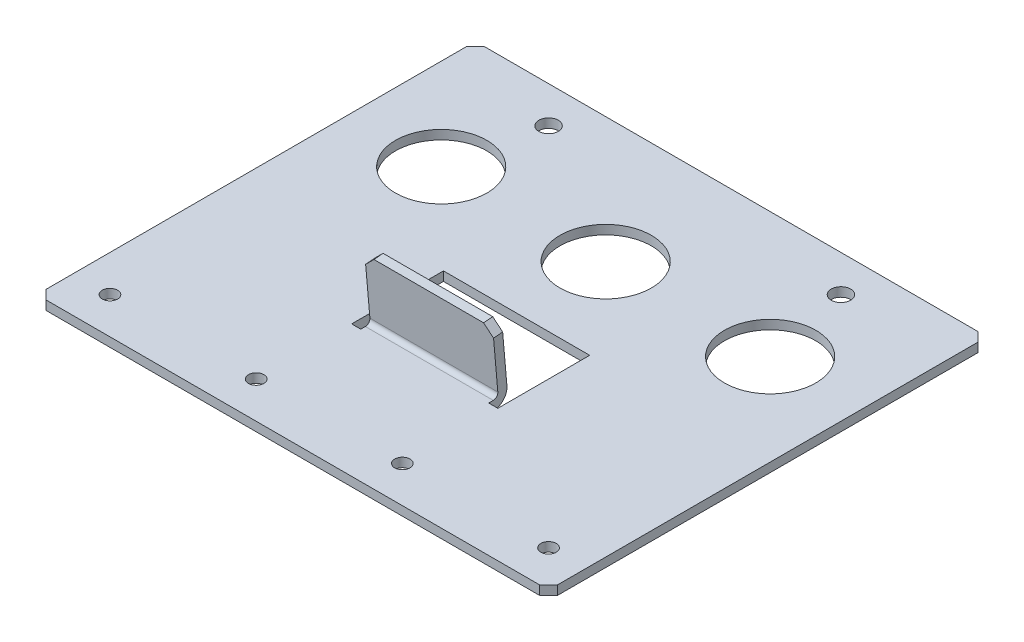
ISO-10303-21;
HEADER;
FILE_DESCRIPTION(('STEP AP214'),'2;1');
FILE_NAME('part.step','',(''),(''),'','','');
FILE_SCHEMA(('AUTOMOTIVE_DESIGN { 1 0 10303 214 1 1 1 1 }'));
ENDSEC;
DATA;
#1=APPLICATION_CONTEXT('core data for automotive mechanical design processes');
#2=APPLICATION_PROTOCOL_DEFINITION('international standard','automotive_design',2000,#1);
#3=PRODUCT_CONTEXT('',#1,'mechanical');
#4=PRODUCT('Part','Part','',(#3));
#5=PRODUCT_RELATED_PRODUCT_CATEGORY('part','',(#4));
#6=PRODUCT_DEFINITION_FORMATION('','',#4);
#7=PRODUCT_DEFINITION_CONTEXT('part definition',#1,'design');
#8=PRODUCT_DEFINITION('design','',#6,#7);
#9=PRODUCT_DEFINITION_SHAPE('','',#8);
#10=(LENGTH_UNIT() NAMED_UNIT(*) SI_UNIT(.MILLI.,.METRE.));
#11=(NAMED_UNIT(*) PLANE_ANGLE_UNIT() SI_UNIT($,.RADIAN.));
#12=(NAMED_UNIT(*) SI_UNIT($,.STERADIAN.) SOLID_ANGLE_UNIT());
#13=UNCERTAINTY_MEASURE_WITH_UNIT(LENGTH_MEASURE(1.E-05),#10,'distance_accuracy_value','');
#14=(GEOMETRIC_REPRESENTATION_CONTEXT(3) GLOBAL_UNCERTAINTY_ASSIGNED_CONTEXT((#13)) GLOBAL_UNIT_ASSIGNED_CONTEXT((#10,
#11,#12)) REPRESENTATION_CONTEXT('',''));
#15=CARTESIAN_POINT('',(0.,0.,0.));
#16=DIRECTION('',(0.,0.,1.));
#17=DIRECTION('',(1.,0.,0.));
#18=AXIS2_PLACEMENT_3D('',#15,#16,#17);
#19=CARTESIAN_POINT('',(0.,4.5484969537626,-48.8024300962654));
#20=DIRECTION('',(0.,-0.087155742747654,0.996194698091746));
#21=DIRECTION('',(0.,-0.996194698091746,-0.087155742747654));
#22=AXIS2_PLACEMENT_3D('',#19,#20,#21);
#23=PLANE('',#22);
#24=DIRECTION('',(-1.,0.,0.));
#25=VECTOR('',#24,1.);
#26=CARTESIAN_POINT('',(66.675,1.72585974161136,-49.0493788535667));
#27=LINE('',#26,#25);
#28=CARTESIAN_POINT('',(66.675,1.72585974161203,-49.04937885357));
#29=VERTEX_POINT('',#28);
#30=CARTESIAN_POINT('',(111.125,1.72585974161203,-49.04937885357));
#31=VERTEX_POINT('',#30);
#32=EDGE_CURVE('E174',#29,#31,#27,.F.);
#33=ORIENTED_EDGE('',*,*,#32,.T.);
#34=DIRECTION('',(0.,0.996194698091734,0.0871557427477868));
#35=VECTOR('',#34,1.);
#36=CARTESIAN_POINT('',(111.125,1.72585974161194,-49.0493788535734));
#37=LINE('',#36,#35);
#38=CARTESIAN_POINT('',(111.125,18.6887076818647,-47.565321957685));
#39=VERTEX_POINT('',#38);
#40=EDGE_CURVE('E326',#31,#39,#37,.T.);
#41=ORIENTED_EDGE('',*,*,#40,.T.);
#42=DIRECTION('',(-0.707106781186592,0.70441602640294,0.0616284167136347));
#43=VECTOR('',#42,1.);
#44=CARTESIAN_POINT('',(111.125,18.6887076818647,-47.565321957685));
#45=LINE('',#44,#43);
#46=CARTESIAN_POINT('',(107.95,21.8516258483066,-47.2886024744728));
#47=VERTEX_POINT('',#46);
#48=EDGE_CURVE('E217',#39,#47,#45,.T.);
#49=ORIENTED_EDGE('',*,*,#48,.T.);
#50=DIRECTION('',(1.,0.,0.));
#51=VECTOR('',#50,1.);
#52=CARTESIAN_POINT('',(111.125,21.8516258483064,-47.2886024744728));
#53=LINE('',#52,#51);
#54=CARTESIAN_POINT('',(69.8500000000001,21.8516258483066,-47.2886024744728));
#55=VERTEX_POINT('',#54);
#56=EDGE_CURVE('E223',#47,#55,#53,.F.);
#57=ORIENTED_EDGE('',*,*,#56,.T.);
#58=DIRECTION('',(-0.707106781186592,-0.70441602640294,-0.0616284167136334));
#59=VECTOR('',#58,1.);
#60=CARTESIAN_POINT('',(69.8500000000002,21.8516258483066,-47.2886024744728));
#61=LINE('',#60,#59);
#62=CARTESIAN_POINT('',(66.675,18.6887076818647,-47.565321957685));
#63=VERTEX_POINT('',#62);
#64=EDGE_CURVE('E228',#55,#63,#61,.T.);
#65=ORIENTED_EDGE('',*,*,#64,.T.);
#66=DIRECTION('',(0.,-0.996194698091734,-0.0871557427477868));
#67=VECTOR('',#66,1.);
#68=CARTESIAN_POINT('',(66.675,18.6887076818647,-47.565321957685));
#69=LINE('',#68,#67);
#70=EDGE_CURVE('E163',#63,#29,#69,.T.);
#71=ORIENTED_EDGE('',*,*,#70,.T.);
#72=EDGE_LOOP('',(#33,#41,#49,#57,#65,#71));
#73=FACE_BOUND('',#72,.T.);
#74=ADVANCED_FACE('F17',(#73),#23,.T.);
#75=CARTESIAN_POINT('',(111.125,22.1283453315292,-50.4515206409022));
#76=DIRECTION('',(0.,-0.996194698091746,-0.087155742747654));
#77=DIRECTION('',(0.,0.087155742747654,-0.996194698091746));
#78=AXIS2_PLACEMENT_3D('',#75,#76,#77);
#79=PLANE('',#78);
#80=DIRECTION('',(1.,0.,0.));
#81=VECTOR('',#80,1.);
#82=CARTESIAN_POINT('',(0.,22.1283453315285,-50.4515206408947));
#83=LINE('',#82,#81);
#84=CARTESIAN_POINT('',(107.95,22.1283453315285,-50.4515206408947));
#85=VERTEX_POINT('',#84);
#86=CARTESIAN_POINT('',(69.85,22.1283453315285,-50.4515206408947));
#87=VERTEX_POINT('',#86);
#88=EDGE_CURVE('E177',#85,#87,#83,.F.);
#89=ORIENTED_EDGE('',*,*,#88,.T.);
#90=DIRECTION('',(0.,-0.0871557427475919,0.996194698091751));
#91=VECTOR('',#90,1.);
#92=CARTESIAN_POINT('',(69.85,22.1283453315292,-50.4515206409022));
#93=LINE('',#92,#91);
#94=EDGE_CURVE('E225',#87,#55,#93,.T.);
#95=ORIENTED_EDGE('',*,*,#94,.T.);
#96=ORIENTED_EDGE('',*,*,#56,.F.);
#97=DIRECTION('',(0.,0.0871557427475908,-0.996194698091751));
#98=VECTOR('',#97,1.);
#99=CARTESIAN_POINT('',(107.95,21.8516258483067,-47.2886024744728));
#100=LINE('',#99,#98);
#101=EDGE_CURVE('E219',#47,#85,#100,.T.);
#102=ORIENTED_EDGE('',*,*,#101,.T.);
#103=EDGE_LOOP('',(#89,#95,#96,#102));
#104=FACE_BOUND('',#103,.T.);
#105=ADVANCED_FACE('F342',(#104),#79,.F.);
#106=CARTESIAN_POINT('',(69.85,22.1283453315292,-50.4515206409022));
#107=DIRECTION('',(0.707106781186503,-0.704416026402803,-0.0616284167162203));
#108=DIRECTION('',(0.705757556807996,0.708453436019904,0.));
#109=AXIS2_PLACEMENT_3D('',#106,#107,#108);
#110=PLANE('',#109);
#111=ORIENTED_EDGE('',*,*,#64,.F.);
#112=ORIENTED_EDGE('',*,*,#94,.F.);
#113=DIRECTION('',(-0.707106781186606,-0.704416026402701,-0.061628416716211));
#114=VECTOR('',#113,1.);
#115=CARTESIAN_POINT('',(69.85,22.1283453315285,-50.4515206408947));
#116=LINE('',#115,#114);
#117=CARTESIAN_POINT('',(66.675,18.9654271650877,-50.7282401241184));
#118=VERTEX_POINT('',#117);
#119=EDGE_CURVE('E314',#87,#118,#116,.T.);
#120=ORIENTED_EDGE('',*,*,#119,.T.);
#121=DIRECTION('',(0.,-0.0871557427476279,0.996194698091748));
#122=VECTOR('',#121,1.);
#123=CARTESIAN_POINT('',(66.675,18.9654271650896,-50.7282401241398));
#124=LINE('',#123,#122);
#125=EDGE_CURVE('E220',#118,#63,#124,.T.);
#126=ORIENTED_EDGE('',*,*,#125,.T.);
#127=EDGE_LOOP('',(#111,#112,#120,#126));
#128=FACE_BOUND('',#127,.T.);
#129=ADVANCED_FACE('F347',(#128),#110,.F.);
#130=CARTESIAN_POINT('',(111.125,18.9654271650896,-50.7282401241398));
#131=DIRECTION('',(-0.707106781186503,-0.704416026402803,-0.0616284167162203));
#132=DIRECTION('',(0.705757556807996,-0.708453436019904,0.));
#133=AXIS2_PLACEMENT_3D('',#130,#131,#132);
#134=PLANE('',#133);
#135=ORIENTED_EDGE('',*,*,#48,.F.);
#136=DIRECTION('',(0.,0.0871557427476279,-0.996194698091748));
#137=VECTOR('',#136,1.);
#138=CARTESIAN_POINT('',(111.125,18.6887076818647,-47.565321957685));
#139=LINE('',#138,#137);
#140=CARTESIAN_POINT('',(111.125,18.9654271650877,-50.7282401241184));
#141=VERTEX_POINT('',#140);
#142=EDGE_CURVE('E330',#39,#141,#139,.T.);
#143=ORIENTED_EDGE('',*,*,#142,.T.);
#144=DIRECTION('',(-0.707106781186607,0.7044160264027,0.0616284167162109));
#145=VECTOR('',#144,1.);
#146=CARTESIAN_POINT('',(111.125,18.9654271650877,-50.7282401241184));
#147=LINE('',#146,#145);
#148=EDGE_CURVE('E291',#141,#85,#147,.T.);
#149=ORIENTED_EDGE('',*,*,#148,.T.);
#150=ORIENTED_EDGE('',*,*,#101,.F.);
#151=EDGE_LOOP('',(#135,#143,#149,#150));
#152=FACE_BOUND('',#151,.T.);
#153=ADVANCED_FACE('F341',(#152),#134,.F.);
#154=CARTESIAN_POINT('',(66.675,1.5875,-47.467919770346));
#155=DIRECTION('',(-1.,0.,0.));
#156=DIRECTION('',(0.,0.,1.));
#157=AXIS2_PLACEMENT_3D('',#154,#155,#156);
#158=CYLINDRICAL_SURFACE('',#157,1.5875);
#159=ORIENTED_EDGE('',*,*,#32,.F.);
#160=CARTESIAN_POINT('',(66.675,1.5875,-47.467919770346));
#161=DIRECTION('',(-1.,0.,0.));
#162=DIRECTION('',(0.,0.,1.));
#163=AXIS2_PLACEMENT_3D('',#160,#161,#162);
#164=CIRCLE('',#163,1.5875);
#165=CARTESIAN_POINT('',(66.675,0.,-47.467919770346));
#166=VERTEX_POINT('',#165);
#167=EDGE_CURVE('E20',#29,#166,#164,.T.);
#168=ORIENTED_EDGE('',*,*,#167,.T.);
#169=DIRECTION('',(1.,0.,0.));
#170=VECTOR('',#169,1.);
#171=CARTESIAN_POINT('',(0.,0.,-47.467919770346));
#172=LINE('',#171,#170);
#173=CARTESIAN_POINT('',(111.125,0.,-47.467919770346));
#174=VERTEX_POINT('',#173);
#175=EDGE_CURVE('E172',#166,#174,#172,.T.);
#176=ORIENTED_EDGE('',*,*,#175,.T.);
#177=CARTESIAN_POINT('',(111.125,1.5875,-47.467919770346));
#178=DIRECTION('',(-1.,0.,0.));
#179=DIRECTION('',(0.,0.,1.));
#180=AXIS2_PLACEMENT_3D('',#177,#178,#179);
#181=CIRCLE('',#180,1.5875);
#182=EDGE_CURVE('E196',#31,#174,#181,.T.);
#183=ORIENTED_EDGE('',*,*,#182,.F.);
#184=EDGE_LOOP('',(#159,#168,#176,#183));
#185=FACE_BOUND('',#184,.T.);
#186=ADVANCED_FACE('F170',(#185),#158,.F.);
#187=CARTESIAN_POINT('',(66.675,1.5875,-47.467919770346));
#188=DIRECTION('',(1.,0.,0.));
#189=DIRECTION('',(0.,0.,-1.));
#190=AXIS2_PLACEMENT_3D('',#187,#188,#189);
#191=PLANE('',#190);
#192=DIRECTION('',(0.,-0.996194698091746,-0.087155742747654));
#193=VECTOR('',#192,1.);
#194=CARTESIAN_POINT('',(66.675,4.8252164369875,-51.9653482626948));
#195=LINE('',#194,#193);
#196=CARTESIAN_POINT('',(66.675,2.0025792248353,-52.2122970200063));
#197=VERTEX_POINT('',#196);
#198=EDGE_CURVE('E302',#118,#197,#195,.T.);
#199=ORIENTED_EDGE('',*,*,#198,.T.);
#200=CARTESIAN_POINT('',(66.675,1.5875,-47.467919770346));
#201=DIRECTION('',(-1.,0.,0.));
#202=DIRECTION('',(0.,0.,1.));
#203=AXIS2_PLACEMENT_3D('',#200,#201,#202);
#204=CIRCLE('',#203,4.7625);
#205=CARTESIAN_POINT('',(66.675,-3.175,-47.467919770346));
#206=VERTEX_POINT('',#205);
#207=EDGE_CURVE('E206',#206,#197,#204,.F.);
#208=ORIENTED_EDGE('',*,*,#207,.F.);
#209=DIRECTION('',(0.,0.,1.));
#210=VECTOR('',#209,1.);
#211=CARTESIAN_POINT('',(66.675,-3.175,-45.880419770346));
#212=LINE('',#211,#210);
#213=CARTESIAN_POINT('',(66.675,-3.175,-45.880419770346));
#214=VERTEX_POINT('',#213);
#215=EDGE_CURVE('E178',#206,#214,#212,.T.);
#216=ORIENTED_EDGE('',*,*,#215,.T.);
#217=DIRECTION('',(0.,1.,0.));
#218=VECTOR('',#217,1.);
#219=CARTESIAN_POINT('',(66.675,0.,-45.880419770346));
#220=LINE('',#219,#218);
#221=CARTESIAN_POINT('',(66.675,0.,-45.880419770346));
#222=VERTEX_POINT('',#221);
#223=EDGE_CURVE('E191',#222,#214,#220,.F.);
#224=ORIENTED_EDGE('',*,*,#223,.F.);
#225=DIRECTION('',(0.,0.,-1.));
#226=VECTOR('',#225,1.);
#227=CARTESIAN_POINT('',(66.675,0.,0.));
#228=LINE('',#227,#226);
#229=EDGE_CURVE('E183',#222,#166,#228,.T.);
#230=ORIENTED_EDGE('',*,*,#229,.T.);
#231=ORIENTED_EDGE('',*,*,#167,.F.);
#232=ORIENTED_EDGE('',*,*,#70,.F.);
#233=ORIENTED_EDGE('',*,*,#125,.F.);
#234=EDGE_LOOP('',(#199,#208,#216,#224,#230,#231,#232,#233));
#235=FACE_BOUND('',#234,.T.);
#236=ADVANCED_FACE('F189',(#235),#191,.F.);
#237=CARTESIAN_POINT('',(0.,4.8252164369875,-51.9653482626948));
#238=DIRECTION('',(0.,-0.087155742747654,0.996194698091746));
#239=DIRECTION('',(0.,-0.996194698091746,-0.087155742747654));
#240=AXIS2_PLACEMENT_3D('',#237,#238,#239);
#241=PLANE('',#240);
#242=DIRECTION('',(0.,-0.996194698091746,-0.087155742747654));
#243=VECTOR('',#242,1.);
#244=CARTESIAN_POINT('',(111.125,4.8252164369875,-51.9653482626948));
#245=LINE('',#244,#243);
#246=CARTESIAN_POINT('',(111.125,2.00257922483559,-52.2122970200062));
#247=VERTEX_POINT('',#246);
#248=EDGE_CURVE('E295',#247,#141,#245,.F.);
#249=ORIENTED_EDGE('',*,*,#248,.F.);
#250=DIRECTION('',(-1.,0.,0.));
#251=VECTOR('',#250,1.);
#252=CARTESIAN_POINT('',(66.675,2.0025792248352,-52.212297020008));
#253=LINE('',#252,#251);
#254=EDGE_CURVE('E280',#197,#247,#253,.F.);
#255=ORIENTED_EDGE('',*,*,#254,.F.);
#256=ORIENTED_EDGE('',*,*,#198,.F.);
#257=ORIENTED_EDGE('',*,*,#119,.F.);
#258=ORIENTED_EDGE('',*,*,#88,.F.);
#259=ORIENTED_EDGE('',*,*,#148,.F.);
#260=EDGE_LOOP('',(#249,#255,#256,#257,#258,#259));
#261=FACE_BOUND('',#260,.T.);
#262=ADVANCED_FACE('F353',(#261),#241,.F.);
#263=CARTESIAN_POINT('',(111.125,0.,-47.467919770346));
#264=DIRECTION('',(1.,0.,0.));
#265=DIRECTION('',(0.,0.,-1.));
#266=AXIS2_PLACEMENT_3D('',#263,#264,#265);
#267=PLANE('',#266);
#268=DIRECTION('',(0.,1.,0.));
#269=VECTOR('',#268,1.);
#270=CARTESIAN_POINT('',(111.125,0.,-45.880419770346));
#271=LINE('',#270,#269);
#272=CARTESIAN_POINT('',(111.125,-3.175,-45.880419770346));
#273=VERTEX_POINT('',#272);
#274=CARTESIAN_POINT('',(111.125,0.,-45.880419770346));
#275=VERTEX_POINT('',#274);
#276=EDGE_CURVE('E279',#273,#275,#271,.T.);
#277=ORIENTED_EDGE('',*,*,#276,.F.);
#278=DIRECTION('',(0.,0.,-1.));
#279=VECTOR('',#278,1.);
#280=CARTESIAN_POINT('',(111.125,-3.175,-47.467919770346));
#281=LINE('',#280,#279);
#282=CARTESIAN_POINT('',(111.125,-3.175,-47.467919770346));
#283=VERTEX_POINT('',#282);
#284=EDGE_CURVE('E193',#273,#283,#281,.T.);
#285=ORIENTED_EDGE('',*,*,#284,.T.);
#286=CARTESIAN_POINT('',(111.125,1.5875,-47.467919770346));
#287=DIRECTION('',(-1.,0.,0.));
#288=DIRECTION('',(0.,0.,1.));
#289=AXIS2_PLACEMENT_3D('',#286,#287,#288);
#290=CIRCLE('',#289,4.7625);
#291=EDGE_CURVE('E276',#247,#283,#290,.T.);
#292=ORIENTED_EDGE('',*,*,#291,.F.);
#293=ORIENTED_EDGE('',*,*,#248,.T.);
#294=ORIENTED_EDGE('',*,*,#142,.F.);
#295=ORIENTED_EDGE('',*,*,#40,.F.);
#296=ORIENTED_EDGE('',*,*,#182,.T.);
#297=DIRECTION('',(0.,0.,-1.));
#298=VECTOR('',#297,1.);
#299=CARTESIAN_POINT('',(111.125,0.,0.));
#300=LINE('',#299,#298);
#301=EDGE_CURVE('E186',#174,#275,#300,.F.);
#302=ORIENTED_EDGE('',*,*,#301,.T.);
#303=EDGE_LOOP('',(#277,#285,#292,#293,#294,#295,#296,#302));
#304=FACE_BOUND('',#303,.T.);
#305=ADVANCED_FACE('F339',(#304),#267,.T.);
#306=CARTESIAN_POINT('',(0.,0.,0.));
#307=DIRECTION('',(0.,-1.,0.));
#308=DIRECTION('',(0.,0.,-1.));
#309=AXIS2_PLACEMENT_3D('',#306,#307,#308);
#310=PLANE('',#309);
#311=DIRECTION('',(1.,0.,0.));
#312=VECTOR('',#311,1.);
#313=CARTESIAN_POINT('',(0.,0.,-77.7875));
#314=LINE('',#313,#312);
#315=CARTESIAN_POINT('',(114.3,0.,-77.7875));
#316=VERTEX_POINT('',#315);
#317=CARTESIAN_POINT('',(63.5,0.,-77.7875));
#318=VERTEX_POINT('',#317);
#319=EDGE_CURVE('E424',#316,#318,#314,.F.);
#320=ORIENTED_EDGE('',*,*,#319,.F.);
#321=DIRECTION('',(0.,0.,1.));
#322=VECTOR('',#321,1.);
#323=CARTESIAN_POINT('',(114.3,0.,0.));
#324=LINE('',#323,#322);
#325=CARTESIAN_POINT('',(114.3,0.,-45.880419770346));
#326=VERTEX_POINT('',#325);
#327=EDGE_CURVE('E429',#326,#316,#324,.F.);
#328=ORIENTED_EDGE('',*,*,#327,.F.);
#329=DIRECTION('',(-1.,0.,0.));
#330=VECTOR('',#329,1.);
#331=CARTESIAN_POINT('',(111.125,0.,-45.880419770346));
#332=LINE('',#331,#330);
#333=EDGE_CURVE('E365',#275,#326,#332,.F.);
#334=ORIENTED_EDGE('',*,*,#333,.F.);
#335=ORIENTED_EDGE('',*,*,#301,.F.);
#336=ORIENTED_EDGE('',*,*,#175,.F.);
#337=ORIENTED_EDGE('',*,*,#229,.F.);
#338=DIRECTION('',(-1.,0.,0.));
#339=VECTOR('',#338,1.);
#340=CARTESIAN_POINT('',(65.0875,0.,-45.880419770346));
#341=LINE('',#340,#339);
#342=CARTESIAN_POINT('',(63.5,0.,-45.880419770346));
#343=VERTEX_POINT('',#342);
#344=EDGE_CURVE('E207',#343,#222,#341,.F.);
#345=ORIENTED_EDGE('',*,*,#344,.F.);
#346=DIRECTION('',(0.,0.,1.));
#347=VECTOR('',#346,1.);
#348=CARTESIAN_POINT('',(63.5,0.,0.));
#349=LINE('',#348,#347);
#350=EDGE_CURVE('E422',#343,#318,#349,.F.);
#351=ORIENTED_EDGE('',*,*,#350,.T.);
#352=EDGE_LOOP('',(#320,#328,#334,#335,#336,#337,#345,#351));
#353=FACE_BOUND('',#352,.T.);
#354=CARTESIAN_POINT('',(38.1,0.,-139.7));
#355=DIRECTION('',(0.,1.,0.));
#356=DIRECTION('',(0.,0.,1.));
#357=AXIS2_PLACEMENT_3D('',#354,#355,#356);
#358=CIRCLE('',#357,3.3782);
#359=CARTESIAN_POINT('',(38.1,0.,-136.3218));
#360=VERTEX_POINT('',#359);
#361=EDGE_CURVE('E256',#360,#360,#358,.F.);
#362=ORIENTED_EDGE('',*,*,#361,.T.);
#363=EDGE_LOOP('',(#362));
#364=FACE_BOUND('',#363,.T.);
#365=CARTESIAN_POINT('',(139.7,0.,-139.7));
#366=DIRECTION('',(0.,1.,0.));
#367=DIRECTION('',(0.,0.,1.));
#368=AXIS2_PLACEMENT_3D('',#365,#366,#367);
#369=CIRCLE('',#368,3.3782);
#370=CARTESIAN_POINT('',(139.7,0.,-136.3218));
#371=VERTEX_POINT('',#370);
#372=EDGE_CURVE('E260',#371,#371,#369,.F.);
#373=ORIENTED_EDGE('',*,*,#372,.T.);
#374=EDGE_LOOP('',(#373));
#375=FACE_BOUND('',#374,.T.);
#376=CARTESIAN_POINT('',(12.7,0.,-12.7));
#377=DIRECTION('',(0.,1.,0.));
#378=DIRECTION('',(0.,0.,1.));
#379=AXIS2_PLACEMENT_3D('',#376,#377,#378);
#380=CIRCLE('',#379,2.667);
#381=CARTESIAN_POINT('',(12.7,0.,-10.033));
#382=VERTEX_POINT('',#381);
#383=EDGE_CURVE('E263',#382,#382,#380,.F.);
#384=ORIENTED_EDGE('',*,*,#383,.T.);
#385=EDGE_LOOP('',(#384));
#386=FACE_BOUND('',#385,.T.);
#387=CARTESIAN_POINT('',(165.1,0.,-12.7));
#388=DIRECTION('',(0.,1.,0.));
#389=DIRECTION('',(0.,0.,1.));
#390=AXIS2_PLACEMENT_3D('',#387,#388,#389);
#391=CIRCLE('',#390,2.667);
#392=CARTESIAN_POINT('',(165.1,0.,-10.033));
#393=VERTEX_POINT('',#392);
#394=EDGE_CURVE('E266',#393,#393,#391,.F.);
#395=ORIENTED_EDGE('',*,*,#394,.T.);
#396=EDGE_LOOP('',(#395));
#397=FACE_BOUND('',#396,.T.);
#398=CARTESIAN_POINT('',(63.5,0.,-12.7));
#399=DIRECTION('',(0.,1.,0.));
#400=DIRECTION('',(0.,0.,1.));
#401=AXIS2_PLACEMENT_3D('',#398,#399,#400);
#402=CIRCLE('',#401,2.667);
#403=CARTESIAN_POINT('',(63.5,0.,-10.033));
#404=VERTEX_POINT('',#403);
#405=EDGE_CURVE('E269',#404,#404,#402,.F.);
#406=ORIENTED_EDGE('',*,*,#405,.T.);
#407=EDGE_LOOP('',(#406));
#408=FACE_BOUND('',#407,.T.);
#409=CARTESIAN_POINT('',(114.3,0.,-12.7));
#410=DIRECTION('',(0.,1.,0.));
#411=DIRECTION('',(0.,0.,1.));
#412=AXIS2_PLACEMENT_3D('',#409,#410,#411);
#413=CIRCLE('',#412,2.667);
#414=CARTESIAN_POINT('',(114.3,0.,-10.033));
#415=VERTEX_POINT('',#414);
#416=EDGE_CURVE('E272',#415,#415,#413,.F.);
#417=ORIENTED_EDGE('',*,*,#416,.T.);
#418=EDGE_LOOP('',(#417));
#419=FACE_BOUND('',#418,.T.);
#420=CARTESIAN_POINT('',(88.9,0.,-108.74375));
#421=DIRECTION('',(0.,1.,0.));
#422=DIRECTION('',(0.,0.,1.));
#423=AXIS2_PLACEMENT_3D('',#420,#421,#422);
#424=CIRCLE('',#423,15.875);
#425=CARTESIAN_POINT('',(88.9,0.,-92.86875));
#426=VERTEX_POINT('',#425);
#427=EDGE_CURVE('E282',#426,#426,#424,.F.);
#428=ORIENTED_EDGE('',*,*,#427,.T.);
#429=EDGE_LOOP('',(#428));
#430=FACE_BOUND('',#429,.T.);
#431=CARTESIAN_POINT('',(146.05,0.,-108.74375));
#432=DIRECTION('',(0.,1.,0.));
#433=DIRECTION('',(0.,0.,1.));
#434=AXIS2_PLACEMENT_3D('',#431,#432,#433);
#435=CIRCLE('',#434,15.875);
#436=CARTESIAN_POINT('',(146.05,0.,-92.86875));
#437=VERTEX_POINT('',#436);
#438=EDGE_CURVE('E285',#437,#437,#435,.F.);
#439=ORIENTED_EDGE('',*,*,#438,.T.);
#440=EDGE_LOOP('',(#439));
#441=FACE_BOUND('',#440,.T.);
#442=CARTESIAN_POINT('',(31.75,0.,-108.74375));
#443=DIRECTION('',(0.,1.,0.));
#444=DIRECTION('',(0.,0.,1.));
#445=AXIS2_PLACEMENT_3D('',#442,#443,#444);
#446=CIRCLE('',#445,15.875);
#447=CARTESIAN_POINT('',(31.75,0.,-92.86875));
#448=VERTEX_POINT('',#447);
#449=EDGE_CURVE('E288',#448,#448,#446,.F.);
#450=ORIENTED_EDGE('',*,*,#449,.T.);
#451=EDGE_LOOP('',(#450));
#452=FACE_BOUND('',#451,.T.);
#453=DIRECTION('',(0.,0.,1.));
#454=VECTOR('',#453,1.);
#455=CARTESIAN_POINT('',(0.,0.,0.));
#456=LINE('',#455,#454);
#457=CARTESIAN_POINT('',(0.,0.,-3.175));
#458=VERTEX_POINT('',#457);
#459=CARTESIAN_POINT('',(0.,0.,-149.225));
#460=VERTEX_POINT('',#459);
#461=EDGE_CURVE('E290',#458,#460,#456,.F.);
#462=ORIENTED_EDGE('',*,*,#461,.F.);
#463=DIRECTION('',(-0.707106781186548,0.,-0.707106781186548));
#464=VECTOR('',#463,1.);
#465=CARTESIAN_POINT('',(0.,0.,-3.175));
#466=LINE('',#465,#464);
#467=CARTESIAN_POINT('',(3.175,0.,0.));
#468=VERTEX_POINT('',#467);
#469=EDGE_CURVE('E446',#458,#468,#466,.F.);
#470=ORIENTED_EDGE('',*,*,#469,.T.);
#471=DIRECTION('',(1.,0.,0.));
#472=VECTOR('',#471,1.);
#473=CARTESIAN_POINT('',(0.,0.,0.));
#474=LINE('',#473,#472);
#475=CARTESIAN_POINT('',(174.625,0.,0.));
#476=VERTEX_POINT('',#475);
#477=EDGE_CURVE('E448',#476,#468,#474,.F.);
#478=ORIENTED_EDGE('',*,*,#477,.F.);
#479=DIRECTION('',(-0.707106781186548,0.,0.707106781186548));
#480=VECTOR('',#479,1.);
#481=CARTESIAN_POINT('',(174.625,0.,0.));
#482=LINE('',#481,#480);
#483=CARTESIAN_POINT('',(177.8,0.,-3.175));
#484=VERTEX_POINT('',#483);
#485=EDGE_CURVE('E456',#476,#484,#482,.F.);
#486=ORIENTED_EDGE('',*,*,#485,.T.);
#487=DIRECTION('',(0.,0.,-1.));
#488=VECTOR('',#487,1.);
#489=CARTESIAN_POINT('',(177.8,0.,0.));
#490=LINE('',#489,#488);
#491=CARTESIAN_POINT('',(177.8,0.,-149.225));
#492=VERTEX_POINT('',#491);
#493=EDGE_CURVE('E458',#492,#484,#490,.F.);
#494=ORIENTED_EDGE('',*,*,#493,.F.);
#495=DIRECTION('',(0.707106781186548,0.,0.707106781186548));
#496=VECTOR('',#495,1.);
#497=CARTESIAN_POINT('',(177.8,0.,-149.225));
#498=LINE('',#497,#496);
#499=CARTESIAN_POINT('',(174.625,0.,-152.4));
#500=VERTEX_POINT('',#499);
#501=EDGE_CURVE('E466',#492,#500,#498,.F.);
#502=ORIENTED_EDGE('',*,*,#501,.T.);
#503=DIRECTION('',(-1.,0.,0.));
#504=VECTOR('',#503,1.);
#505=CARTESIAN_POINT('',(0.,0.,-152.4));
#506=LINE('',#505,#504);
#507=CARTESIAN_POINT('',(3.175,0.,-152.4));
#508=VERTEX_POINT('',#507);
#509=EDGE_CURVE('E468',#508,#500,#506,.F.);
#510=ORIENTED_EDGE('',*,*,#509,.F.);
#511=DIRECTION('',(0.707106781186548,0.,-0.707106781186548));
#512=VECTOR('',#511,1.);
#513=CARTESIAN_POINT('',(3.175,0.,-152.4));
#514=LINE('',#513,#512);
#515=EDGE_CURVE('E382',#508,#460,#514,.F.);
#516=ORIENTED_EDGE('',*,*,#515,.T.);
#517=EDGE_LOOP('',(#462,#470,#478,#486,#494,#502,#510,#516));
#518=FACE_BOUND('',#517,.T.);
#519=ADVANCED_FACE('F181',(#353,#364,#375,#386,#397,#408,#419,#430,#441,#452,#518),#310,.F.);
#520=CARTESIAN_POINT('',(3.175,-3.175,-152.4));
#521=DIRECTION('',(0.707106781186548,0.,0.707106781186548));
#522=DIRECTION('',(0.707106781186548,0.,-0.707106781186548));
#523=AXIS2_PLACEMENT_3D('',#520,#521,#522);
#524=PLANE('',#523);
#525=ORIENTED_EDGE('',*,*,#515,.F.);
#526=DIRECTION('',(0.,1.,0.));
#527=VECTOR('',#526,1.);
#528=CARTESIAN_POINT('',(3.175,-3.175,-152.4));
#529=LINE('',#528,#527);
#530=CARTESIAN_POINT('',(3.175,-3.175,-152.4));
#531=VERTEX_POINT('',#530);
#532=EDGE_CURVE('E470',#531,#508,#529,.T.);
#533=ORIENTED_EDGE('',*,*,#532,.F.);
#534=DIRECTION('',(0.707106781186549,0.,-0.707106781186546));
#535=VECTOR('',#534,1.);
#536=CARTESIAN_POINT('',(0.,-3.175,-149.225));
#537=LINE('',#536,#535);
#538=CARTESIAN_POINT('',(0.,-3.175,-149.225));
#539=VERTEX_POINT('',#538);
#540=EDGE_CURVE('E259',#539,#531,#537,.T.);
#541=ORIENTED_EDGE('',*,*,#540,.F.);
#542=DIRECTION('',(0.,1.,0.));
#543=VECTOR('',#542,1.);
#544=CARTESIAN_POINT('',(0.,-3.175,-149.225));
#545=LINE('',#544,#543);
#546=EDGE_CURVE('E441',#460,#539,#545,.F.);
#547=ORIENTED_EDGE('',*,*,#546,.F.);
#548=EDGE_LOOP('',(#525,#533,#541,#547));
#549=FACE_BOUND('',#548,.T.);
#550=ADVANCED_FACE('F533',(#549),#524,.F.);
#551=CARTESIAN_POINT('',(0.,-3.175,-152.4));
#552=DIRECTION('',(0.,0.,-1.));
#553=DIRECTION('',(-1.,0.,0.));
#554=AXIS2_PLACEMENT_3D('',#551,#552,#553);
#555=PLANE('',#554);
#556=DIRECTION('',(0.,1.,0.));
#557=VECTOR('',#556,1.);
#558=CARTESIAN_POINT('',(174.625,-3.175,-152.4));
#559=LINE('',#558,#557);
#560=CARTESIAN_POINT('',(174.625,-3.175,-152.4));
#561=VERTEX_POINT('',#560);
#562=EDGE_CURVE('E464',#500,#561,#559,.F.);
#563=ORIENTED_EDGE('',*,*,#562,.T.);
#564=DIRECTION('',(1.,0.,0.));
#565=VECTOR('',#564,1.);
#566=CARTESIAN_POINT('',(0.,-3.175,-152.4));
#567=LINE('',#566,#565);
#568=EDGE_CURVE('E415',#531,#561,#567,.T.);
#569=ORIENTED_EDGE('',*,*,#568,.F.);
#570=ORIENTED_EDGE('',*,*,#532,.T.);
#571=ORIENTED_EDGE('',*,*,#509,.T.);
#572=EDGE_LOOP('',(#563,#569,#570,#571));
#573=FACE_BOUND('',#572,.T.);
#574=ADVANCED_FACE('F564',(#573),#555,.T.);
#575=CARTESIAN_POINT('',(177.8,-3.175,-149.225));
#576=DIRECTION('',(-0.707106781186548,0.,0.707106781186548));
#577=DIRECTION('',(0.707106781186548,0.,0.707106781186548));
#578=AXIS2_PLACEMENT_3D('',#575,#576,#577);
#579=PLANE('',#578);
#580=ORIENTED_EDGE('',*,*,#501,.F.);
#581=DIRECTION('',(0.,1.,0.));
#582=VECTOR('',#581,1.);
#583=CARTESIAN_POINT('',(177.8,-3.175,-149.225));
#584=LINE('',#583,#582);
#585=CARTESIAN_POINT('',(177.8,-3.175,-149.225));
#586=VERTEX_POINT('',#585);
#587=EDGE_CURVE('E461',#586,#492,#584,.T.);
#588=ORIENTED_EDGE('',*,*,#587,.F.);
#589=DIRECTION('',(0.707106781186548,0.,0.707106781186548));
#590=VECTOR('',#589,1.);
#591=CARTESIAN_POINT('',(174.625,-3.175,-152.4));
#592=LINE('',#591,#590);
#593=EDGE_CURVE('E412',#561,#586,#592,.T.);
#594=ORIENTED_EDGE('',*,*,#593,.F.);
#595=ORIENTED_EDGE('',*,*,#562,.F.);
#596=EDGE_LOOP('',(#580,#588,#594,#595));
#597=FACE_BOUND('',#596,.T.);
#598=ADVANCED_FACE('F563',(#597),#579,.F.);
#599=CARTESIAN_POINT('',(177.8,-3.175,0.));
#600=DIRECTION('',(1.,0.,0.));
#601=DIRECTION('',(0.,0.,-1.));
#602=AXIS2_PLACEMENT_3D('',#599,#600,#601);
#603=PLANE('',#602);
#604=DIRECTION('',(0.,1.,0.));
#605=VECTOR('',#604,1.);
#606=CARTESIAN_POINT('',(177.8,-3.175,-3.17499999999999));
#607=LINE('',#606,#605);
#608=CARTESIAN_POINT('',(177.8,-3.175,-3.175));
#609=VERTEX_POINT('',#608);
#610=EDGE_CURVE('E454',#484,#609,#607,.F.);
#611=ORIENTED_EDGE('',*,*,#610,.T.);
#612=DIRECTION('',(0.,0.,-1.));
#613=VECTOR('',#612,1.);
#614=CARTESIAN_POINT('',(177.8,-3.175,0.));
#615=LINE('',#614,#613);
#616=EDGE_CURVE('E409',#586,#609,#615,.F.);
#617=ORIENTED_EDGE('',*,*,#616,.F.);
#618=ORIENTED_EDGE('',*,*,#587,.T.);
#619=ORIENTED_EDGE('',*,*,#493,.T.);
#620=EDGE_LOOP('',(#611,#617,#618,#619));
#621=FACE_BOUND('',#620,.T.);
#622=ADVANCED_FACE('F555',(#621),#603,.T.);
#623=CARTESIAN_POINT('',(174.625,-3.175,0.));
#624=DIRECTION('',(-0.707106781186548,0.,-0.707106781186548));
#625=DIRECTION('',(-0.707106781186548,0.,0.707106781186548));
#626=AXIS2_PLACEMENT_3D('',#623,#624,#625);
#627=PLANE('',#626);
#628=ORIENTED_EDGE('',*,*,#485,.F.);
#629=DIRECTION('',(0.,1.,0.));
#630=VECTOR('',#629,1.);
#631=CARTESIAN_POINT('',(174.625,-3.175,0.));
#632=LINE('',#631,#630);
#633=CARTESIAN_POINT('',(174.625,-3.175,0.));
#634=VERTEX_POINT('',#633);
#635=EDGE_CURVE('E451',#634,#476,#632,.T.);
#636=ORIENTED_EDGE('',*,*,#635,.F.);
#637=DIRECTION('',(-0.707106781186546,0.,0.707106781186549));
#638=VECTOR('',#637,1.);
#639=CARTESIAN_POINT('',(177.8,-3.175,-3.175));
#640=LINE('',#639,#638);
#641=EDGE_CURVE('E406',#609,#634,#640,.T.);
#642=ORIENTED_EDGE('',*,*,#641,.F.);
#643=ORIENTED_EDGE('',*,*,#610,.F.);
#644=EDGE_LOOP('',(#628,#636,#642,#643));
#645=FACE_BOUND('',#644,.T.);
#646=ADVANCED_FACE('F558',(#645),#627,.F.);
#647=CARTESIAN_POINT('',(0.,-3.175,0.));
#648=DIRECTION('',(0.,0.,1.));
#649=DIRECTION('',(1.,0.,0.));
#650=AXIS2_PLACEMENT_3D('',#647,#648,#649);
#651=PLANE('',#650);
#652=DIRECTION('',(0.,1.,0.));
#653=VECTOR('',#652,1.);
#654=CARTESIAN_POINT('',(3.175,-3.175,0.));
#655=LINE('',#654,#653);
#656=CARTESIAN_POINT('',(3.175,-3.175,0.));
#657=VERTEX_POINT('',#656);
#658=EDGE_CURVE('E444',#468,#657,#655,.F.);
#659=ORIENTED_EDGE('',*,*,#658,.T.);
#660=DIRECTION('',(1.,0.,0.));
#661=VECTOR('',#660,1.);
#662=CARTESIAN_POINT('',(0.,-3.175,0.));
#663=LINE('',#662,#661);
#664=EDGE_CURVE('E403',#634,#657,#663,.F.);
#665=ORIENTED_EDGE('',*,*,#664,.F.);
#666=ORIENTED_EDGE('',*,*,#635,.T.);
#667=ORIENTED_EDGE('',*,*,#477,.T.);
#668=EDGE_LOOP('',(#659,#665,#666,#667));
#669=FACE_BOUND('',#668,.T.);
#670=ADVANCED_FACE('F550',(#669),#651,.T.);
#671=CARTESIAN_POINT('',(0.,-3.175,-3.175));
#672=DIRECTION('',(0.707106781186548,0.,-0.707106781186548));
#673=DIRECTION('',(-0.707106781186548,0.,-0.707106781186548));
#674=AXIS2_PLACEMENT_3D('',#671,#672,#673);
#675=PLANE('',#674);
#676=ORIENTED_EDGE('',*,*,#469,.F.);
#677=DIRECTION('',(0.,1.,0.));
#678=VECTOR('',#677,1.);
#679=CARTESIAN_POINT('',(0.,-3.175,-3.175));
#680=LINE('',#679,#678);
#681=CARTESIAN_POINT('',(0.,-3.175,-3.175));
#682=VERTEX_POINT('',#681);
#683=EDGE_CURVE('E438',#682,#458,#680,.T.);
#684=ORIENTED_EDGE('',*,*,#683,.F.);
#685=DIRECTION('',(-0.707106781186547,0.,-0.707106781186547));
#686=VECTOR('',#685,1.);
#687=CARTESIAN_POINT('',(3.175,-3.175,0.));
#688=LINE('',#687,#686);
#689=EDGE_CURVE('E400',#657,#682,#688,.T.);
#690=ORIENTED_EDGE('',*,*,#689,.F.);
#691=ORIENTED_EDGE('',*,*,#658,.F.);
#692=EDGE_LOOP('',(#676,#684,#690,#691));
#693=FACE_BOUND('',#692,.T.);
#694=ADVANCED_FACE('F546',(#693),#675,.F.);
#695=CARTESIAN_POINT('',(0.,-3.175,0.));
#696=DIRECTION('',(-1.,0.,0.));
#697=DIRECTION('',(0.,0.,1.));
#698=AXIS2_PLACEMENT_3D('',#695,#696,#697);
#699=PLANE('',#698);
#700=ORIENTED_EDGE('',*,*,#683,.T.);
#701=ORIENTED_EDGE('',*,*,#461,.T.);
#702=ORIENTED_EDGE('',*,*,#546,.T.);
#703=DIRECTION('',(0.,0.,-1.));
#704=VECTOR('',#703,1.);
#705=CARTESIAN_POINT('',(0.,-3.175,0.));
#706=LINE('',#705,#704);
#707=EDGE_CURVE('E255',#682,#539,#706,.T.);
#708=ORIENTED_EDGE('',*,*,#707,.F.);
#709=EDGE_LOOP('',(#700,#701,#702,#708));
#710=FACE_BOUND('',#709,.T.);
#711=ADVANCED_FACE('F543',(#710),#699,.T.);
#712=CARTESIAN_POINT('',(31.75,-3.175,-108.74375));
#713=DIRECTION('',(0.,1.,0.));
#714=DIRECTION('',(0.,0.,1.));
#715=AXIS2_PLACEMENT_3D('',#712,#713,#714);
#716=CYLINDRICAL_SURFACE('',#715,15.875);
#717=CARTESIAN_POINT('',(31.75,-3.175,-108.74375));
#718=DIRECTION('',(0.,1.,0.));
#719=DIRECTION('',(0.,0.,1.));
#720=AXIS2_PLACEMENT_3D('',#717,#718,#719);
#721=CIRCLE('',#720,15.875);
#722=CARTESIAN_POINT('',(31.75,-3.175,-92.86875));
#723=VERTEX_POINT('',#722);
#724=EDGE_CURVE('E252',#723,#723,#721,.T.);
#725=ORIENTED_EDGE('',*,*,#724,.F.);
#726=EDGE_LOOP('',(#725));
#727=FACE_BOUND('',#726,.T.);
#728=ORIENTED_EDGE('',*,*,#449,.F.);
#729=EDGE_LOOP('',(#728));
#730=FACE_BOUND('',#729,.T.);
#731=ADVANCED_FACE('F700',(#727,#730),#716,.F.);
#732=CARTESIAN_POINT('',(146.05,-3.175,-108.74375));
#733=DIRECTION('',(0.,1.,0.));
#734=DIRECTION('',(0.,0.,1.));
#735=AXIS2_PLACEMENT_3D('',#732,#733,#734);
#736=CYLINDRICAL_SURFACE('',#735,15.875);
#737=CARTESIAN_POINT('',(146.05,-3.175,-108.74375));
#738=DIRECTION('',(0.,1.,0.));
#739=DIRECTION('',(0.,0.,1.));
#740=AXIS2_PLACEMENT_3D('',#737,#738,#739);
#741=CIRCLE('',#740,15.875);
#742=CARTESIAN_POINT('',(146.05,-3.175,-92.86875));
#743=VERTEX_POINT('',#742);
#744=EDGE_CURVE('E249',#743,#743,#741,.T.);
#745=ORIENTED_EDGE('',*,*,#744,.F.);
#746=EDGE_LOOP('',(#745));
#747=FACE_BOUND('',#746,.T.);
#748=ORIENTED_EDGE('',*,*,#438,.F.);
#749=EDGE_LOOP('',(#748));
#750=FACE_BOUND('',#749,.T.);
#751=ADVANCED_FACE('F709',(#747,#750),#736,.F.);
#752=CARTESIAN_POINT('',(88.9,-3.175,-108.74375));
#753=DIRECTION('',(0.,1.,0.));
#754=DIRECTION('',(0.,0.,1.));
#755=AXIS2_PLACEMENT_3D('',#752,#753,#754);
#756=CYLINDRICAL_SURFACE('',#755,15.875);
#757=CARTESIAN_POINT('',(88.9,-3.175,-108.74375));
#758=DIRECTION('',(0.,1.,0.));
#759=DIRECTION('',(0.,0.,1.));
#760=AXIS2_PLACEMENT_3D('',#757,#758,#759);
#761=CIRCLE('',#760,15.875);
#762=CARTESIAN_POINT('',(88.9,-3.175,-92.86875));
#763=VERTEX_POINT('',#762);
#764=EDGE_CURVE('E214',#763,#763,#761,.T.);
#765=ORIENTED_EDGE('',*,*,#764,.F.);
#766=EDGE_LOOP('',(#765));
#767=FACE_BOUND('',#766,.T.);
#768=ORIENTED_EDGE('',*,*,#427,.F.);
#769=EDGE_LOOP('',(#768));
#770=FACE_BOUND('',#769,.T.);
#771=ADVANCED_FACE('F719',(#767,#770),#756,.F.);
#772=CARTESIAN_POINT('',(65.0875,0.,-45.880419770346));
#773=DIRECTION('',(0.,0.,-1.));
#774=DIRECTION('',(-1.,0.,0.));
#775=AXIS2_PLACEMENT_3D('',#772,#773,#774);
#776=PLANE('',#775);
#777=ORIENTED_EDGE('',*,*,#223,.T.);
#778=DIRECTION('',(1.,0.,0.));
#779=VECTOR('',#778,1.);
#780=CARTESIAN_POINT('',(0.,-3.175,-45.880419770346));
#781=LINE('',#780,#779);
#782=CARTESIAN_POINT('',(63.5,-3.175,-45.880419770346));
#783=VERTEX_POINT('',#782);
#784=EDGE_CURVE('E210',#783,#214,#781,.T.);
#785=ORIENTED_EDGE('',*,*,#784,.F.);
#786=DIRECTION('',(0.,1.,0.));
#787=VECTOR('',#786,1.);
#788=CARTESIAN_POINT('',(63.5,-3.175,-45.880419770346));
#789=LINE('',#788,#787);
#790=EDGE_CURVE('E275',#783,#343,#789,.T.);
#791=ORIENTED_EDGE('',*,*,#790,.T.);
#792=ORIENTED_EDGE('',*,*,#344,.T.);
#793=EDGE_LOOP('',(#777,#785,#791,#792));
#794=FACE_BOUND('',#793,.T.);
#795=ADVANCED_FACE('F387',(#794),#776,.T.);
#796=CARTESIAN_POINT('',(66.675,1.5875,-47.467919770346));
#797=DIRECTION('',(-1.,0.,0.));
#798=DIRECTION('',(0.,0.,1.));
#799=AXIS2_PLACEMENT_3D('',#796,#797,#798);
#800=CYLINDRICAL_SURFACE('',#799,4.7625);
#801=ORIENTED_EDGE('',*,*,#291,.T.);
#802=DIRECTION('',(1.,0.,0.));
#803=VECTOR('',#802,1.);
#804=CARTESIAN_POINT('',(0.,-3.175,-47.467919770346));
#805=LINE('',#804,#803);
#806=EDGE_CURVE('E213',#206,#283,#805,.T.);
#807=ORIENTED_EDGE('',*,*,#806,.F.);
#808=ORIENTED_EDGE('',*,*,#207,.T.);
#809=ORIENTED_EDGE('',*,*,#254,.T.);
#810=EDGE_LOOP('',(#801,#807,#808,#809));
#811=FACE_BOUND('',#810,.T.);
#812=ADVANCED_FACE('F385',(#811),#800,.T.);
#813=CARTESIAN_POINT('',(111.125,0.,-45.880419770346));
#814=DIRECTION('',(0.,0.,-1.));
#815=DIRECTION('',(-1.,0.,0.));
#816=AXIS2_PLACEMENT_3D('',#813,#814,#815);
#817=PLANE('',#816);
#818=DIRECTION('',(0.,1.,0.));
#819=VECTOR('',#818,1.);
#820=CARTESIAN_POINT('',(114.3,-3.175,-45.880419770346));
#821=LINE('',#820,#819);
#822=CARTESIAN_POINT('',(114.3,-3.175,-45.880419770346));
#823=VERTEX_POINT('',#822);
#824=EDGE_CURVE('E431',#823,#326,#821,.T.);
#825=ORIENTED_EDGE('',*,*,#824,.F.);
#826=DIRECTION('',(1.,0.,0.));
#827=VECTOR('',#826,1.);
#828=CARTESIAN_POINT('',(0.,-3.175,-45.880419770346));
#829=LINE('',#828,#827);
#830=EDGE_CURVE('E368',#273,#823,#829,.T.);
#831=ORIENTED_EDGE('',*,*,#830,.F.);
#832=ORIENTED_EDGE('',*,*,#276,.T.);
#833=ORIENTED_EDGE('',*,*,#333,.T.);
#834=EDGE_LOOP('',(#825,#831,#832,#833));
#835=FACE_BOUND('',#834,.T.);
#836=ADVANCED_FACE('F480',(#835),#817,.T.);
#837=CARTESIAN_POINT('',(114.3,-3.175,0.));
#838=DIRECTION('',(-1.,0.,0.));
#839=DIRECTION('',(0.,0.,1.));
#840=AXIS2_PLACEMENT_3D('',#837,#838,#839);
#841=PLANE('',#840);
#842=ORIENTED_EDGE('',*,*,#824,.T.);
#843=ORIENTED_EDGE('',*,*,#327,.T.);
#844=DIRECTION('',(0.,1.,0.));
#845=VECTOR('',#844,1.);
#846=CARTESIAN_POINT('',(114.3,-3.175,-77.7875));
#847=LINE('',#846,#845);
#848=CARTESIAN_POINT('',(114.3,-3.175,-77.7875));
#849=VERTEX_POINT('',#848);
#850=EDGE_CURVE('E426',#849,#316,#847,.T.);
#851=ORIENTED_EDGE('',*,*,#850,.F.);
#852=DIRECTION('',(0.,0.,-1.));
#853=VECTOR('',#852,1.);
#854=CARTESIAN_POINT('',(114.3,-3.175,0.));
#855=LINE('',#854,#853);
#856=EDGE_CURVE('E371',#823,#849,#855,.T.);
#857=ORIENTED_EDGE('',*,*,#856,.F.);
#858=EDGE_LOOP('',(#842,#843,#851,#857));
#859=FACE_BOUND('',#858,.T.);
#860=ADVANCED_FACE('F483',(#859),#841,.T.);
#861=CARTESIAN_POINT('',(0.,-3.175,-77.7875));
#862=DIRECTION('',(0.,0.,1.));
#863=DIRECTION('',(1.,0.,0.));
#864=AXIS2_PLACEMENT_3D('',#861,#862,#863);
#865=PLANE('',#864);
#866=ORIENTED_EDGE('',*,*,#850,.T.);
#867=ORIENTED_EDGE('',*,*,#319,.T.);
#868=DIRECTION('',(0.,1.,0.));
#869=VECTOR('',#868,1.);
#870=CARTESIAN_POINT('',(63.5,-3.175,-77.7875));
#871=LINE('',#870,#869);
#872=CARTESIAN_POINT('',(63.5,-3.175,-77.7875));
#873=VERTEX_POINT('',#872);
#874=EDGE_CURVE('E35',#318,#873,#871,.F.);
#875=ORIENTED_EDGE('',*,*,#874,.T.);
#876=DIRECTION('',(1.,0.,0.));
#877=VECTOR('',#876,1.);
#878=CARTESIAN_POINT('',(0.,-3.175,-77.7875));
#879=LINE('',#878,#877);
#880=EDGE_CURVE('E376',#849,#873,#879,.F.);
#881=ORIENTED_EDGE('',*,*,#880,.F.);
#882=EDGE_LOOP('',(#866,#867,#875,#881));
#883=FACE_BOUND('',#882,.T.);
#884=ADVANCED_FACE('F484',(#883),#865,.T.);
#885=CARTESIAN_POINT('',(63.5,-3.175,0.));
#886=DIRECTION('',(-1.,0.,0.));
#887=DIRECTION('',(0.,0.,1.));
#888=AXIS2_PLACEMENT_3D('',#885,#886,#887);
#889=PLANE('',#888);
#890=DIRECTION('',(0.,0.,-1.));
#891=VECTOR('',#890,1.);
#892=CARTESIAN_POINT('',(63.5,-3.175,0.));
#893=LINE('',#892,#891);
#894=EDGE_CURVE('E246',#873,#783,#893,.F.);
#895=ORIENTED_EDGE('',*,*,#894,.F.);
#896=ORIENTED_EDGE('',*,*,#874,.F.);
#897=ORIENTED_EDGE('',*,*,#350,.F.);
#898=ORIENTED_EDGE('',*,*,#790,.F.);
#899=EDGE_LOOP('',(#895,#896,#897,#898));
#900=FACE_BOUND('',#899,.T.);
#901=ADVANCED_FACE('F486',(#900),#889,.F.);
#902=CARTESIAN_POINT('',(114.3,-3.175,-12.7));
#903=DIRECTION('',(0.,1.,0.));
#904=DIRECTION('',(0.,0.,1.));
#905=AXIS2_PLACEMENT_3D('',#902,#903,#904);
#906=CYLINDRICAL_SURFACE('',#905,2.667);
#907=CARTESIAN_POINT('',(114.3,-3.175,-12.7));
#908=DIRECTION('',(0.,1.,0.));
#909=DIRECTION('',(0.,0.,1.));
#910=AXIS2_PLACEMENT_3D('',#907,#908,#909);
#911=CIRCLE('',#910,2.667);
#912=CARTESIAN_POINT('',(114.3,-3.175,-10.033));
#913=VERTEX_POINT('',#912);
#914=EDGE_CURVE('E243',#913,#913,#911,.T.);
#915=ORIENTED_EDGE('',*,*,#914,.F.);
#916=EDGE_LOOP('',(#915));
#917=FACE_BOUND('',#916,.T.);
#918=ORIENTED_EDGE('',*,*,#416,.F.);
#919=EDGE_LOOP('',(#918));
#920=FACE_BOUND('',#919,.T.);
#921=ADVANCED_FACE('F493',(#917,#920),#906,.F.);
#922=CARTESIAN_POINT('',(63.5,-3.175,-12.7));
#923=DIRECTION('',(0.,1.,0.));
#924=DIRECTION('',(0.,0.,1.));
#925=AXIS2_PLACEMENT_3D('',#922,#923,#924);
#926=CYLINDRICAL_SURFACE('',#925,2.667);
#927=CARTESIAN_POINT('',(63.5,-3.175,-12.7));
#928=DIRECTION('',(0.,1.,0.));
#929=DIRECTION('',(0.,0.,1.));
#930=AXIS2_PLACEMENT_3D('',#927,#928,#929);
#931=CIRCLE('',#930,2.667);
#932=CARTESIAN_POINT('',(63.5,-3.175,-10.033));
#933=VERTEX_POINT('',#932);
#934=EDGE_CURVE('E240',#933,#933,#931,.T.);
#935=ORIENTED_EDGE('',*,*,#934,.F.);
#936=EDGE_LOOP('',(#935));
#937=FACE_BOUND('',#936,.T.);
#938=ORIENTED_EDGE('',*,*,#405,.F.);
#939=EDGE_LOOP('',(#938));
#940=FACE_BOUND('',#939,.T.);
#941=ADVANCED_FACE('F518',(#937,#940),#926,.F.);
#942=CARTESIAN_POINT('',(165.1,-3.175,-12.7));
#943=DIRECTION('',(0.,1.,0.));
#944=DIRECTION('',(0.,0.,1.));
#945=AXIS2_PLACEMENT_3D('',#942,#943,#944);
#946=CYLINDRICAL_SURFACE('',#945,2.667);
#947=CARTESIAN_POINT('',(165.1,-3.175,-12.7));
#948=DIRECTION('',(0.,1.,0.));
#949=DIRECTION('',(0.,0.,1.));
#950=AXIS2_PLACEMENT_3D('',#947,#948,#949);
#951=CIRCLE('',#950,2.667);
#952=CARTESIAN_POINT('',(165.1,-3.175,-10.033));
#953=VERTEX_POINT('',#952);
#954=EDGE_CURVE('E237',#953,#953,#951,.T.);
#955=ORIENTED_EDGE('',*,*,#954,.F.);
#956=EDGE_LOOP('',(#955));
#957=FACE_BOUND('',#956,.T.);
#958=ORIENTED_EDGE('',*,*,#394,.F.);
#959=EDGE_LOOP('',(#958));
#960=FACE_BOUND('',#959,.T.);
#961=ADVANCED_FACE('F514',(#957,#960),#946,.F.);
#962=CARTESIAN_POINT('',(12.7,-3.175,-12.7));
#963=DIRECTION('',(0.,1.,0.));
#964=DIRECTION('',(0.,0.,1.));
#965=AXIS2_PLACEMENT_3D('',#962,#963,#964);
#966=CYLINDRICAL_SURFACE('',#965,2.667);
#967=CARTESIAN_POINT('',(12.7,-3.175,-12.7));
#968=DIRECTION('',(0.,1.,0.));
#969=DIRECTION('',(0.,0.,1.));
#970=AXIS2_PLACEMENT_3D('',#967,#968,#969);
#971=CIRCLE('',#970,2.667);
#972=CARTESIAN_POINT('',(12.7,-3.175,-10.033));
#973=VERTEX_POINT('',#972);
#974=EDGE_CURVE('E234',#973,#973,#971,.T.);
#975=ORIENTED_EDGE('',*,*,#974,.F.);
#976=EDGE_LOOP('',(#975));
#977=FACE_BOUND('',#976,.T.);
#978=ORIENTED_EDGE('',*,*,#383,.F.);
#979=EDGE_LOOP('',(#978));
#980=FACE_BOUND('',#979,.T.);
#981=ADVANCED_FACE('F510',(#977,#980),#966,.F.);
#982=CARTESIAN_POINT('',(139.7,-3.175,-139.7));
#983=DIRECTION('',(0.,1.,0.));
#984=DIRECTION('',(0.,0.,1.));
#985=AXIS2_PLACEMENT_3D('',#982,#983,#984);
#986=CYLINDRICAL_SURFACE('',#985,3.3782);
#987=CARTESIAN_POINT('',(139.7,-3.175,-139.7));
#988=DIRECTION('',(0.,1.,0.));
#989=DIRECTION('',(0.,0.,1.));
#990=AXIS2_PLACEMENT_3D('',#987,#988,#989);
#991=CIRCLE('',#990,3.3782);
#992=CARTESIAN_POINT('',(139.7,-3.175,-136.3218));
#993=VERTEX_POINT('',#992);
#994=EDGE_CURVE('E26',#993,#993,#991,.T.);
#995=ORIENTED_EDGE('',*,*,#994,.F.);
#996=EDGE_LOOP('',(#995));
#997=FACE_BOUND('',#996,.T.);
#998=ORIENTED_EDGE('',*,*,#372,.F.);
#999=EDGE_LOOP('',(#998));
#1000=FACE_BOUND('',#999,.T.);
#1001=ADVANCED_FACE('F503',(#997,#1000),#986,.F.);
#1002=CARTESIAN_POINT('',(38.1,-3.175,-139.7));
#1003=DIRECTION('',(0.,1.,0.));
#1004=DIRECTION('',(0.,0.,1.));
#1005=AXIS2_PLACEMENT_3D('',#1002,#1003,#1004);
#1006=CYLINDRICAL_SURFACE('',#1005,3.3782);
#1007=CARTESIAN_POINT('',(38.1,-3.175,-139.7));
#1008=DIRECTION('',(0.,1.,0.));
#1009=DIRECTION('',(0.,0.,1.));
#1010=AXIS2_PLACEMENT_3D('',#1007,#1008,#1009);
#1011=CIRCLE('',#1010,3.3782);
#1012=CARTESIAN_POINT('',(38.1,-3.175,-136.3218));
#1013=VERTEX_POINT('',#1012);
#1014=EDGE_CURVE('E11',#1013,#1013,#1011,.T.);
#1015=ORIENTED_EDGE('',*,*,#1014,.F.);
#1016=EDGE_LOOP('',(#1015));
#1017=FACE_BOUND('',#1016,.T.);
#1018=ORIENTED_EDGE('',*,*,#361,.F.);
#1019=EDGE_LOOP('',(#1018));
#1020=FACE_BOUND('',#1019,.T.);
#1021=ADVANCED_FACE('F497',(#1017,#1020),#1006,.F.);
#1022=CARTESIAN_POINT('',(0.,-3.175,0.));
#1023=DIRECTION('',(0.,-1.,0.));
#1024=DIRECTION('',(0.,0.,-1.));
#1025=AXIS2_PLACEMENT_3D('',#1022,#1023,#1024);
#1026=PLANE('',#1025);
#1027=ORIENTED_EDGE('',*,*,#1014,.T.);
#1028=EDGE_LOOP('',(#1027));
#1029=FACE_BOUND('',#1028,.T.);
#1030=ORIENTED_EDGE('',*,*,#994,.T.);
#1031=EDGE_LOOP('',(#1030));
#1032=FACE_BOUND('',#1031,.T.);
#1033=ORIENTED_EDGE('',*,*,#974,.T.);
#1034=EDGE_LOOP('',(#1033));
#1035=FACE_BOUND('',#1034,.T.);
#1036=ORIENTED_EDGE('',*,*,#954,.T.);
#1037=EDGE_LOOP('',(#1036));
#1038=FACE_BOUND('',#1037,.T.);
#1039=ORIENTED_EDGE('',*,*,#934,.T.);
#1040=EDGE_LOOP('',(#1039));
#1041=FACE_BOUND('',#1040,.T.);
#1042=ORIENTED_EDGE('',*,*,#914,.T.);
#1043=EDGE_LOOP('',(#1042));
#1044=FACE_BOUND('',#1043,.T.);
#1045=ORIENTED_EDGE('',*,*,#880,.T.);
#1046=ORIENTED_EDGE('',*,*,#894,.T.);
#1047=ORIENTED_EDGE('',*,*,#784,.T.);
#1048=ORIENTED_EDGE('',*,*,#215,.F.);
#1049=ORIENTED_EDGE('',*,*,#806,.T.);
#1050=ORIENTED_EDGE('',*,*,#284,.F.);
#1051=ORIENTED_EDGE('',*,*,#830,.T.);
#1052=ORIENTED_EDGE('',*,*,#856,.T.);
#1053=EDGE_LOOP('',(#1045,#1046,#1047,#1048,#1049,#1050,#1051,#1052));
#1054=FACE_BOUND('',#1053,.T.);
#1055=ORIENTED_EDGE('',*,*,#764,.T.);
#1056=EDGE_LOOP('',(#1055));
#1057=FACE_BOUND('',#1056,.T.);
#1058=ORIENTED_EDGE('',*,*,#744,.T.);
#1059=EDGE_LOOP('',(#1058));
#1060=FACE_BOUND('',#1059,.T.);
#1061=ORIENTED_EDGE('',*,*,#724,.T.);
#1062=EDGE_LOOP('',(#1061));
#1063=FACE_BOUND('',#1062,.T.);
#1064=ORIENTED_EDGE('',*,*,#689,.T.);
#1065=ORIENTED_EDGE('',*,*,#707,.T.);
#1066=ORIENTED_EDGE('',*,*,#540,.T.);
#1067=ORIENTED_EDGE('',*,*,#568,.T.);
#1068=ORIENTED_EDGE('',*,*,#593,.T.);
#1069=ORIENTED_EDGE('',*,*,#616,.T.);
#1070=ORIENTED_EDGE('',*,*,#641,.T.);
#1071=ORIENTED_EDGE('',*,*,#664,.T.);
#1072=EDGE_LOOP('',(#1064,#1065,#1066,#1067,#1068,#1069,#1070,#1071));
#1073=FACE_BOUND('',#1072,.T.);
#1074=ADVANCED_FACE('F392',(#1029,#1032,#1035,#1038,#1041,#1044,#1054,#1057,#1060,#1063,#1073),
#1026,.T.);
#1075=CLOSED_SHELL('',(#74,#105,#129,#153,#186,#236,#262,#305,#519,#550,#574,#598,#622,#646,
#670,#694,#711,#731,#751,#771,#795,#812,#836,#860,#884,#901,#921,#941,#961,#981,#1001,#1021,#1074));
#1076=MANIFOLD_SOLID_BREP('B1',#1075);
#1077=ADVANCED_BREP_SHAPE_REPRESENTATION('',(#18,#1076),#14);
#1078=SHAPE_DEFINITION_REPRESENTATION(#9,#1077);
ENDSEC;
END-ISO-10303-21;
